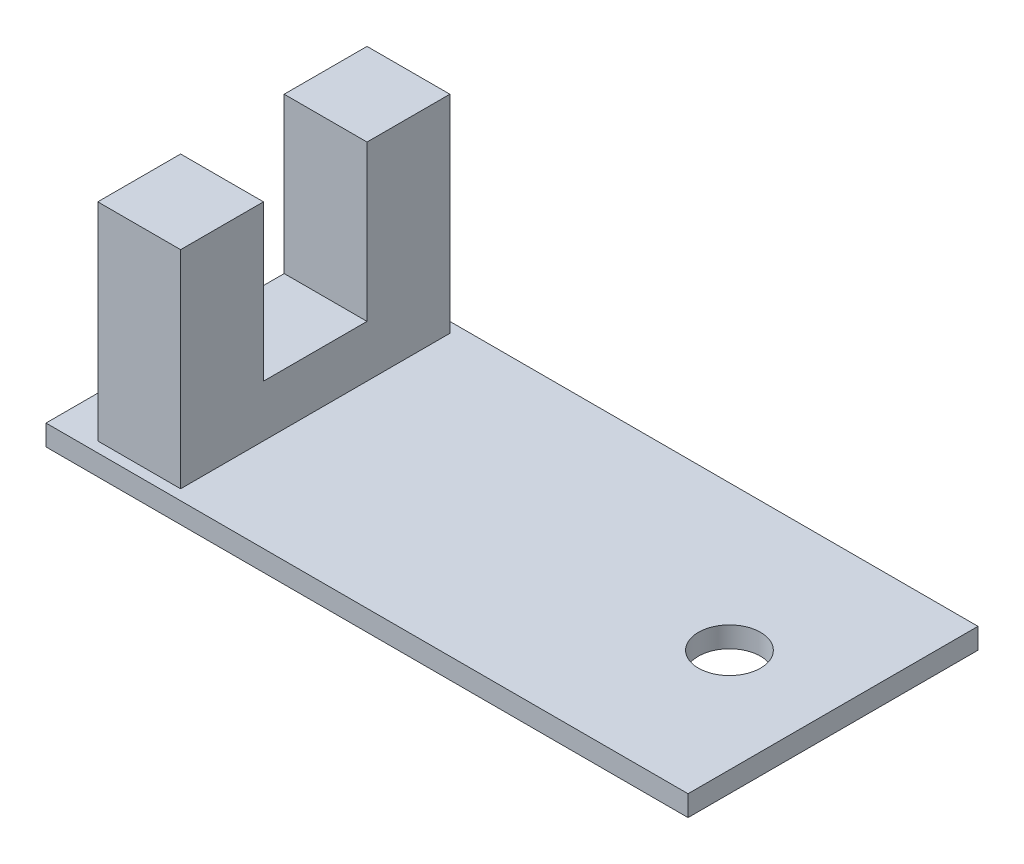
ISO-10303-21;
HEADER;
FILE_DESCRIPTION(('STEP AP214'),'2;1');
FILE_NAME('part.step','',(''),(''),'','','');
FILE_SCHEMA(('AUTOMOTIVE_DESIGN { 1 0 10303 214 1 1 1 1 }'));
ENDSEC;
DATA;
#1=APPLICATION_CONTEXT('core data for automotive mechanical design processes');
#2=APPLICATION_PROTOCOL_DEFINITION('international standard','automotive_design',2000,#1);
#3=PRODUCT_CONTEXT('',#1,'mechanical');
#4=PRODUCT('Part','Part','',(#3));
#5=PRODUCT_RELATED_PRODUCT_CATEGORY('part','',(#4));
#6=PRODUCT_DEFINITION_FORMATION('','',#4);
#7=PRODUCT_DEFINITION_CONTEXT('part definition',#1,'design');
#8=PRODUCT_DEFINITION('design','',#6,#7);
#9=PRODUCT_DEFINITION_SHAPE('','',#8);
#10=(LENGTH_UNIT() NAMED_UNIT(*) SI_UNIT(.MILLI.,.METRE.));
#11=(NAMED_UNIT(*) PLANE_ANGLE_UNIT() SI_UNIT($,.RADIAN.));
#12=(NAMED_UNIT(*) SI_UNIT($,.STERADIAN.) SOLID_ANGLE_UNIT());
#13=UNCERTAINTY_MEASURE_WITH_UNIT(LENGTH_MEASURE(1.E-05),#10,'distance_accuracy_value','');
#14=(GEOMETRIC_REPRESENTATION_CONTEXT(3) GLOBAL_UNCERTAINTY_ASSIGNED_CONTEXT((#13)) GLOBAL_UNIT_ASSIGNED_CONTEXT((#10,
#11,#12)) REPRESENTATION_CONTEXT('',''));
#15=CARTESIAN_POINT('',(0.,0.,0.));
#16=DIRECTION('',(0.,0.,1.));
#17=DIRECTION('',(1.,0.,0.));
#18=AXIS2_PLACEMENT_3D('',#15,#16,#17);
#19=CARTESIAN_POINT('',(0.,1.,0.));
#20=DIRECTION('',(0.,1.,0.));
#21=DIRECTION('',(0.,0.,1.));
#22=AXIS2_PLACEMENT_3D('',#19,#20,#21);
#23=PLANE('',#22);
#24=CARTESIAN_POINT('',(26.,1.,7.));
#25=DIRECTION('',(0.,1.,0.));
#26=DIRECTION('',(0.,0.,1.));
#27=AXIS2_PLACEMENT_3D('',#24,#25,#26);
#28=CIRCLE('',#27,1.5);
#29=CARTESIAN_POINT('',(26.,1.,8.5));
#30=VERTEX_POINT('',#29);
#31=EDGE_CURVE('E361',#30,#30,#28,.T.);
#32=ORIENTED_EDGE('',*,*,#31,.F.);
#33=EDGE_LOOP('',(#32));
#34=FACE_BOUND('',#33,.T.);
#35=DIRECTION('',(0.,0.,1.));
#36=VECTOR('',#35,1.);
#37=CARTESIAN_POINT('',(0.,1.,0.));
#38=LINE('',#37,#36);
#39=CARTESIAN_POINT('',(0.,1.,0.));
#40=VERTEX_POINT('',#39);
#41=CARTESIAN_POINT('',(0.,1.,14.));
#42=VERTEX_POINT('',#41);
#43=EDGE_CURVE('E172',#40,#42,#38,.T.);
#44=ORIENTED_EDGE('',*,*,#43,.T.);
#45=DIRECTION('',(1.,0.,0.));
#46=VECTOR('',#45,1.);
#47=CARTESIAN_POINT('',(0.,1.,14.));
#48=LINE('',#47,#46);
#49=CARTESIAN_POINT('',(31.,1.,14.));
#50=VERTEX_POINT('',#49);
#51=EDGE_CURVE('E84',#42,#50,#48,.T.);
#52=ORIENTED_EDGE('',*,*,#51,.T.);
#53=DIRECTION('',(0.,0.,-1.));
#54=VECTOR('',#53,1.);
#55=CARTESIAN_POINT('',(31.,1.,0.));
#56=LINE('',#55,#54);
#57=CARTESIAN_POINT('',(31.,1.,0.));
#58=VERTEX_POINT('',#57);
#59=EDGE_CURVE('E175',#50,#58,#56,.T.);
#60=ORIENTED_EDGE('',*,*,#59,.T.);
#61=DIRECTION('',(-1.,0.,0.));
#62=VECTOR('',#61,1.);
#63=CARTESIAN_POINT('',(0.,1.,0.));
#64=LINE('',#63,#62);
#65=EDGE_CURVE('E56',#58,#40,#64,.T.);
#66=ORIENTED_EDGE('',*,*,#65,.T.);
#67=EDGE_LOOP('',(#44,#52,#60,#66));
#68=FACE_BOUND('',#67,.T.);
#69=DIRECTION('',(0.,0.,1.));
#70=VECTOR('',#69,1.);
#71=CARTESIAN_POINT('',(2.,1.,13.5));
#72=LINE('',#71,#70);
#73=CARTESIAN_POINT('',(2.,1.,0.5));
#74=VERTEX_POINT('',#73);
#75=CARTESIAN_POINT('',(2.,1.,13.5));
#76=VERTEX_POINT('',#75);
#77=EDGE_CURVE('E388',#74,#76,#72,.T.);
#78=ORIENTED_EDGE('',*,*,#77,.F.);
#79=DIRECTION('',(-1.,0.,0.));
#80=VECTOR('',#79,1.);
#81=CARTESIAN_POINT('',(2.,1.,0.5));
#82=LINE('',#81,#80);
#83=CARTESIAN_POINT('',(6.,1.,0.5));
#84=VERTEX_POINT('',#83);
#85=EDGE_CURVE('E363',#84,#74,#82,.T.);
#86=ORIENTED_EDGE('',*,*,#85,.F.);
#87=DIRECTION('',(0.,0.,-1.));
#88=VECTOR('',#87,1.);
#89=CARTESIAN_POINT('',(6.,1.,13.5));
#90=LINE('',#89,#88);
#91=CARTESIAN_POINT('',(6.,1.,13.5));
#92=VERTEX_POINT('',#91);
#93=EDGE_CURVE('E47',#92,#84,#90,.T.);
#94=ORIENTED_EDGE('',*,*,#93,.F.);
#95=DIRECTION('',(1.,0.,0.));
#96=VECTOR('',#95,1.);
#97=CARTESIAN_POINT('',(2.,1.,13.5));
#98=LINE('',#97,#96);
#99=EDGE_CURVE('E393',#76,#92,#98,.T.);
#100=ORIENTED_EDGE('',*,*,#99,.F.);
#101=EDGE_LOOP('',(#78,#86,#94,#100));
#102=FACE_BOUND('',#101,.T.);
#103=ADVANCED_FACE('F32',(#34,#68,#102),#23,.T.);
#104=CARTESIAN_POINT('',(0.,1.,0.));
#105=DIRECTION('',(1.,0.,0.));
#106=DIRECTION('',(0.,0.,-1.));
#107=AXIS2_PLACEMENT_3D('',#104,#105,#106);
#108=PLANE('',#107);
#109=DIRECTION('',(0.,0.,1.));
#110=VECTOR('',#109,1.);
#111=CARTESIAN_POINT('',(0.,0.,0.));
#112=LINE('',#111,#110);
#113=CARTESIAN_POINT('',(0.,0.,0.));
#114=VERTEX_POINT('',#113);
#115=CARTESIAN_POINT('',(0.,0.,14.));
#116=VERTEX_POINT('',#115);
#117=EDGE_CURVE('E171',#114,#116,#112,.T.);
#118=ORIENTED_EDGE('',*,*,#117,.T.);
#119=DIRECTION('',(0.,-1.,0.));
#120=VECTOR('',#119,1.);
#121=CARTESIAN_POINT('',(0.,1.,14.));
#122=LINE('',#121,#120);
#123=EDGE_CURVE('E11',#42,#116,#122,.T.);
#124=ORIENTED_EDGE('',*,*,#123,.F.);
#125=ORIENTED_EDGE('',*,*,#43,.F.);
#126=DIRECTION('',(0.,-1.,0.));
#127=VECTOR('',#126,1.);
#128=CARTESIAN_POINT('',(0.,1.,0.));
#129=LINE('',#128,#127);
#130=EDGE_CURVE('E178',#40,#114,#129,.T.);
#131=ORIENTED_EDGE('',*,*,#130,.T.);
#132=EDGE_LOOP('',(#118,#124,#125,#131));
#133=FACE_BOUND('',#132,.T.);
#134=ADVANCED_FACE('F34',(#133),#108,.F.);
#135=CARTESIAN_POINT('',(0.,1.,14.));
#136=DIRECTION('',(0.,0.,-1.));
#137=DIRECTION('',(-1.,0.,0.));
#138=AXIS2_PLACEMENT_3D('',#135,#136,#137);
#139=PLANE('',#138);
#140=DIRECTION('',(1.,0.,0.));
#141=VECTOR('',#140,1.);
#142=CARTESIAN_POINT('',(0.,0.,14.));
#143=LINE('',#142,#141);
#144=CARTESIAN_POINT('',(31.,0.,14.));
#145=VERTEX_POINT('',#144);
#146=EDGE_CURVE('E181',#116,#145,#143,.T.);
#147=ORIENTED_EDGE('',*,*,#146,.T.);
#148=DIRECTION('',(0.,-1.,0.));
#149=VECTOR('',#148,1.);
#150=CARTESIAN_POINT('',(31.,1.,14.));
#151=LINE('',#150,#149);
#152=EDGE_CURVE('E40',#50,#145,#151,.T.);
#153=ORIENTED_EDGE('',*,*,#152,.F.);
#154=ORIENTED_EDGE('',*,*,#51,.F.);
#155=ORIENTED_EDGE('',*,*,#123,.T.);
#156=EDGE_LOOP('',(#147,#153,#154,#155));
#157=FACE_BOUND('',#156,.T.);
#158=ADVANCED_FACE('F209',(#157),#139,.F.);
#159=CARTESIAN_POINT('',(31.,1.,0.));
#160=DIRECTION('',(-1.,0.,0.));
#161=DIRECTION('',(0.,0.,1.));
#162=AXIS2_PLACEMENT_3D('',#159,#160,#161);
#163=PLANE('',#162);
#164=DIRECTION('',(0.,0.,-1.));
#165=VECTOR('',#164,1.);
#166=CARTESIAN_POINT('',(31.,0.,0.));
#167=LINE('',#166,#165);
#168=CARTESIAN_POINT('',(31.,0.,0.));
#169=VERTEX_POINT('',#168);
#170=EDGE_CURVE('E183',#145,#169,#167,.T.);
#171=ORIENTED_EDGE('',*,*,#170,.T.);
#172=DIRECTION('',(0.,-1.,0.));
#173=VECTOR('',#172,1.);
#174=CARTESIAN_POINT('',(31.,1.,0.));
#175=LINE('',#174,#173);
#176=EDGE_CURVE('E187',#58,#169,#175,.T.);
#177=ORIENTED_EDGE('',*,*,#176,.F.);
#178=ORIENTED_EDGE('',*,*,#59,.F.);
#179=ORIENTED_EDGE('',*,*,#152,.T.);
#180=EDGE_LOOP('',(#171,#177,#178,#179));
#181=FACE_BOUND('',#180,.T.);
#182=ADVANCED_FACE('F192',(#181),#163,.F.);
#183=CARTESIAN_POINT('',(0.,1.,0.));
#184=DIRECTION('',(0.,0.,1.));
#185=DIRECTION('',(1.,0.,0.));
#186=AXIS2_PLACEMENT_3D('',#183,#184,#185);
#187=PLANE('',#186);
#188=DIRECTION('',(-1.,0.,0.));
#189=VECTOR('',#188,1.);
#190=CARTESIAN_POINT('',(0.,0.,0.));
#191=LINE('',#190,#189);
#192=EDGE_CURVE('E77',#169,#114,#191,.T.);
#193=ORIENTED_EDGE('',*,*,#192,.T.);
#194=ORIENTED_EDGE('',*,*,#130,.F.);
#195=ORIENTED_EDGE('',*,*,#65,.F.);
#196=ORIENTED_EDGE('',*,*,#176,.T.);
#197=EDGE_LOOP('',(#193,#194,#195,#196));
#198=FACE_BOUND('',#197,.T.);
#199=ADVANCED_FACE('F200',(#198),#187,.F.);
#200=CARTESIAN_POINT('',(0.,0.,0.));
#201=DIRECTION('',(0.,1.,0.));
#202=DIRECTION('',(0.,0.,1.));
#203=AXIS2_PLACEMENT_3D('',#200,#201,#202);
#204=PLANE('',#203);
#205=CARTESIAN_POINT('',(26.,0.,7.));
#206=DIRECTION('',(0.,1.,0.));
#207=DIRECTION('',(0.,0.,1.));
#208=AXIS2_PLACEMENT_3D('',#205,#206,#207);
#209=CIRCLE('',#208,1.5);
#210=CARTESIAN_POINT('',(26.,0.,8.5));
#211=VERTEX_POINT('',#210);
#212=EDGE_CURVE('E359',#211,#211,#209,.T.);
#213=ORIENTED_EDGE('',*,*,#212,.T.);
#214=EDGE_LOOP('',(#213));
#215=FACE_BOUND('',#214,.T.);
#216=ORIENTED_EDGE('',*,*,#117,.F.);
#217=ORIENTED_EDGE('',*,*,#192,.F.);
#218=ORIENTED_EDGE('',*,*,#170,.F.);
#219=ORIENTED_EDGE('',*,*,#146,.F.);
#220=EDGE_LOOP('',(#216,#217,#218,#219));
#221=FACE_BOUND('',#220,.T.);
#222=ADVANCED_FACE('F196',(#215,#221),#204,.F.);
#223=CARTESIAN_POINT('',(2.,11.,13.5));
#224=DIRECTION('',(1.,0.,0.));
#225=DIRECTION('',(0.,0.,-1.));
#226=AXIS2_PLACEMENT_3D('',#223,#224,#225);
#227=PLANE('',#226);
#228=ORIENTED_EDGE('',*,*,#77,.T.);
#229=DIRECTION('',(0.,-1.,0.));
#230=VECTOR('',#229,1.);
#231=CARTESIAN_POINT('',(2.,11.,13.5));
#232=LINE('',#231,#230);
#233=CARTESIAN_POINT('',(2.,11.,13.5));
#234=VERTEX_POINT('',#233);
#235=EDGE_CURVE('E169',#234,#76,#232,.T.);
#236=ORIENTED_EDGE('',*,*,#235,.F.);
#237=DIRECTION('',(0.,0.,1.));
#238=VECTOR('',#237,1.);
#239=CARTESIAN_POINT('',(2.,11.,13.5));
#240=LINE('',#239,#238);
#241=CARTESIAN_POINT('',(2.,11.,9.5));
#242=VERTEX_POINT('',#241);
#243=EDGE_CURVE('E158',#242,#234,#240,.T.);
#244=ORIENTED_EDGE('',*,*,#243,.F.);
#245=DIRECTION('',(0.,-1.,0.));
#246=VECTOR('',#245,1.);
#247=CARTESIAN_POINT('',(2.,11.,9.5));
#248=LINE('',#247,#246);
#249=CARTESIAN_POINT('',(2.,3.5,9.5));
#250=VERTEX_POINT('',#249);
#251=EDGE_CURVE('E148',#242,#250,#248,.T.);
#252=ORIENTED_EDGE('',*,*,#251,.T.);
#253=DIRECTION('',(0.,0.,1.));
#254=VECTOR('',#253,1.);
#255=CARTESIAN_POINT('',(2.,3.5,4.5));
#256=LINE('',#255,#254);
#257=CARTESIAN_POINT('',(2.,3.5,4.5));
#258=VERTEX_POINT('',#257);
#259=EDGE_CURVE('E131',#258,#250,#256,.T.);
#260=ORIENTED_EDGE('',*,*,#259,.F.);
#261=DIRECTION('',(0.,-1.,0.));
#262=VECTOR('',#261,1.);
#263=CARTESIAN_POINT('',(2.,11.,4.5));
#264=LINE('',#263,#262);
#265=CARTESIAN_POINT('',(2.,11.,4.5));
#266=VERTEX_POINT('',#265);
#267=EDGE_CURVE('E386',#266,#258,#264,.T.);
#268=ORIENTED_EDGE('',*,*,#267,.F.);
#269=DIRECTION('',(0.,0.,1.));
#270=VECTOR('',#269,1.);
#271=CARTESIAN_POINT('',(2.,11.,4.5));
#272=LINE('',#271,#270);
#273=CARTESIAN_POINT('',(2.,11.,0.5));
#274=VERTEX_POINT('',#273);
#275=EDGE_CURVE('E367',#274,#266,#272,.T.);
#276=ORIENTED_EDGE('',*,*,#275,.F.);
#277=DIRECTION('',(0.,-1.,0.));
#278=VECTOR('',#277,1.);
#279=CARTESIAN_POINT('',(2.,11.,0.5));
#280=LINE('',#279,#278);
#281=EDGE_CURVE('E376',#274,#74,#280,.T.);
#282=ORIENTED_EDGE('',*,*,#281,.T.);
#283=EDGE_LOOP('',(#228,#236,#244,#252,#260,#268,#276,#282));
#284=FACE_BOUND('',#283,.T.);
#285=ADVANCED_FACE('F155',(#284),#227,.F.);
#286=CARTESIAN_POINT('',(2.,11.,13.5));
#287=DIRECTION('',(0.,0.,-1.));
#288=DIRECTION('',(-1.,0.,0.));
#289=AXIS2_PLACEMENT_3D('',#286,#287,#288);
#290=PLANE('',#289);
#291=ORIENTED_EDGE('',*,*,#99,.T.);
#292=DIRECTION('',(0.,-1.,0.));
#293=VECTOR('',#292,1.);
#294=CARTESIAN_POINT('',(6.,11.,13.5));
#295=LINE('',#294,#293);
#296=CARTESIAN_POINT('',(6.,11.,13.5));
#297=VERTEX_POINT('',#296);
#298=EDGE_CURVE('E161',#297,#92,#295,.T.);
#299=ORIENTED_EDGE('',*,*,#298,.F.);
#300=DIRECTION('',(1.,0.,0.));
#301=VECTOR('',#300,1.);
#302=CARTESIAN_POINT('',(2.,11.,13.5));
#303=LINE('',#302,#301);
#304=EDGE_CURVE('E390',#234,#297,#303,.T.);
#305=ORIENTED_EDGE('',*,*,#304,.F.);
#306=ORIENTED_EDGE('',*,*,#235,.T.);
#307=EDGE_LOOP('',(#291,#299,#305,#306));
#308=FACE_BOUND('',#307,.T.);
#309=ADVANCED_FACE('F221',(#308),#290,.F.);
#310=CARTESIAN_POINT('',(6.,11.,13.5));
#311=DIRECTION('',(-1.,0.,0.));
#312=DIRECTION('',(0.,0.,1.));
#313=AXIS2_PLACEMENT_3D('',#310,#311,#312);
#314=PLANE('',#313);
#315=ORIENTED_EDGE('',*,*,#93,.T.);
#316=DIRECTION('',(0.,-1.,0.));
#317=VECTOR('',#316,1.);
#318=CARTESIAN_POINT('',(6.,11.,0.5));
#319=LINE('',#318,#317);
#320=CARTESIAN_POINT('',(6.,11.,0.5));
#321=VERTEX_POINT('',#320);
#322=EDGE_CURVE('E381',#321,#84,#319,.T.);
#323=ORIENTED_EDGE('',*,*,#322,.F.);
#324=DIRECTION('',(0.,0.,-1.));
#325=VECTOR('',#324,1.);
#326=CARTESIAN_POINT('',(6.,11.,4.5));
#327=LINE('',#326,#325);
#328=CARTESIAN_POINT('',(6.,11.,4.5));
#329=VERTEX_POINT('',#328);
#330=EDGE_CURVE('E372',#329,#321,#327,.T.);
#331=ORIENTED_EDGE('',*,*,#330,.F.);
#332=DIRECTION('',(0.,-1.,0.));
#333=VECTOR('',#332,1.);
#334=CARTESIAN_POINT('',(6.,11.,4.5));
#335=LINE('',#334,#333);
#336=CARTESIAN_POINT('',(6.,3.5,4.5));
#337=VERTEX_POINT('',#336);
#338=EDGE_CURVE('E383',#329,#337,#335,.T.);
#339=ORIENTED_EDGE('',*,*,#338,.T.);
#340=DIRECTION('',(0.,0.,-1.));
#341=VECTOR('',#340,1.);
#342=CARTESIAN_POINT('',(6.,3.5,4.5));
#343=LINE('',#342,#341);
#344=CARTESIAN_POINT('',(6.,3.5,9.5));
#345=VERTEX_POINT('',#344);
#346=EDGE_CURVE('E152',#345,#337,#343,.T.);
#347=ORIENTED_EDGE('',*,*,#346,.F.);
#348=DIRECTION('',(0.,-1.,0.));
#349=VECTOR('',#348,1.);
#350=CARTESIAN_POINT('',(6.,11.,9.5));
#351=LINE('',#350,#349);
#352=CARTESIAN_POINT('',(6.,11.,9.5));
#353=VERTEX_POINT('',#352);
#354=EDGE_CURVE('E151',#353,#345,#351,.T.);
#355=ORIENTED_EDGE('',*,*,#354,.F.);
#356=DIRECTION('',(0.,0.,-1.));
#357=VECTOR('',#356,1.);
#358=CARTESIAN_POINT('',(6.,11.,13.5));
#359=LINE('',#358,#357);
#360=EDGE_CURVE('E163',#297,#353,#359,.T.);
#361=ORIENTED_EDGE('',*,*,#360,.F.);
#362=ORIENTED_EDGE('',*,*,#298,.T.);
#363=EDGE_LOOP('',(#315,#323,#331,#339,#347,#355,#361,#362));
#364=FACE_BOUND('',#363,.T.);
#365=ADVANCED_FACE('F224',(#364),#314,.F.);
#366=CARTESIAN_POINT('',(2.,11.,9.5));
#367=DIRECTION('',(0.,0.,1.));
#368=DIRECTION('',(1.,0.,0.));
#369=AXIS2_PLACEMENT_3D('',#366,#367,#368);
#370=PLANE('',#369);
#371=ORIENTED_EDGE('',*,*,#354,.T.);
#372=DIRECTION('',(1.,0.,0.));
#373=VECTOR('',#372,1.);
#374=CARTESIAN_POINT('',(2.,3.5,9.5));
#375=LINE('',#374,#373);
#376=EDGE_CURVE('E134',#250,#345,#375,.T.);
#377=ORIENTED_EDGE('',*,*,#376,.F.);
#378=ORIENTED_EDGE('',*,*,#251,.F.);
#379=DIRECTION('',(-1.,0.,0.));
#380=VECTOR('',#379,1.);
#381=CARTESIAN_POINT('',(2.,11.,9.5));
#382=LINE('',#381,#380);
#383=EDGE_CURVE('E159',#353,#242,#382,.T.);
#384=ORIENTED_EDGE('',*,*,#383,.F.);
#385=EDGE_LOOP('',(#371,#377,#378,#384));
#386=FACE_BOUND('',#385,.T.);
#387=ADVANCED_FACE('F146',(#386),#370,.F.);
#388=CARTESIAN_POINT('',(0.,11.,0.));
#389=DIRECTION('',(0.,-1.,0.));
#390=DIRECTION('',(0.,0.,-1.));
#391=AXIS2_PLACEMENT_3D('',#388,#389,#390);
#392=PLANE('',#391);
#393=ORIENTED_EDGE('',*,*,#243,.T.);
#394=ORIENTED_EDGE('',*,*,#304,.T.);
#395=ORIENTED_EDGE('',*,*,#360,.T.);
#396=ORIENTED_EDGE('',*,*,#383,.T.);
#397=EDGE_LOOP('',(#393,#394,#395,#396));
#398=FACE_BOUND('',#397,.T.);
#399=ADVANCED_FACE('F230',(#398),#392,.F.);
#400=CARTESIAN_POINT('',(2.,11.,4.5));
#401=DIRECTION('',(0.,0.,-1.));
#402=DIRECTION('',(-1.,0.,0.));
#403=AXIS2_PLACEMENT_3D('',#400,#401,#402);
#404=PLANE('',#403);
#405=ORIENTED_EDGE('',*,*,#267,.T.);
#406=DIRECTION('',(-1.,0.,0.));
#407=VECTOR('',#406,1.);
#408=CARTESIAN_POINT('',(2.,3.5,4.5));
#409=LINE('',#408,#407);
#410=EDGE_CURVE('E137',#337,#258,#409,.T.);
#411=ORIENTED_EDGE('',*,*,#410,.F.);
#412=ORIENTED_EDGE('',*,*,#338,.F.);
#413=DIRECTION('',(1.,0.,0.));
#414=VECTOR('',#413,1.);
#415=CARTESIAN_POINT('',(2.,11.,4.5));
#416=LINE('',#415,#414);
#417=EDGE_CURVE('E370',#266,#329,#416,.T.);
#418=ORIENTED_EDGE('',*,*,#417,.F.);
#419=EDGE_LOOP('',(#405,#411,#412,#418));
#420=FACE_BOUND('',#419,.T.);
#421=ADVANCED_FACE('F233',(#420),#404,.F.);
#422=CARTESIAN_POINT('',(2.,11.,0.5));
#423=DIRECTION('',(0.,0.,1.));
#424=DIRECTION('',(1.,0.,0.));
#425=AXIS2_PLACEMENT_3D('',#422,#423,#424);
#426=PLANE('',#425);
#427=ORIENTED_EDGE('',*,*,#85,.T.);
#428=ORIENTED_EDGE('',*,*,#281,.F.);
#429=DIRECTION('',(-1.,0.,0.));
#430=VECTOR('',#429,1.);
#431=CARTESIAN_POINT('',(2.,11.,0.5));
#432=LINE('',#431,#430);
#433=EDGE_CURVE('E374',#321,#274,#432,.T.);
#434=ORIENTED_EDGE('',*,*,#433,.F.);
#435=ORIENTED_EDGE('',*,*,#322,.T.);
#436=EDGE_LOOP('',(#427,#428,#434,#435));
#437=FACE_BOUND('',#436,.T.);
#438=ADVANCED_FACE('F237',(#437),#426,.F.);
#439=CARTESIAN_POINT('',(0.,11.,0.));
#440=DIRECTION('',(0.,-1.,0.));
#441=DIRECTION('',(0.,0.,-1.));
#442=AXIS2_PLACEMENT_3D('',#439,#440,#441);
#443=PLANE('',#442);
#444=ORIENTED_EDGE('',*,*,#275,.T.);
#445=ORIENTED_EDGE('',*,*,#417,.T.);
#446=ORIENTED_EDGE('',*,*,#330,.T.);
#447=ORIENTED_EDGE('',*,*,#433,.T.);
#448=EDGE_LOOP('',(#444,#445,#446,#447));
#449=FACE_BOUND('',#448,.T.);
#450=ADVANCED_FACE('F241',(#449),#443,.F.);
#451=CARTESIAN_POINT('',(26.,0.,7.));
#452=DIRECTION('',(0.,1.,0.));
#453=DIRECTION('',(0.,0.,1.));
#454=AXIS2_PLACEMENT_3D('',#451,#452,#453);
#455=CYLINDRICAL_SURFACE('',#454,1.5);
#456=ORIENTED_EDGE('',*,*,#212,.F.);
#457=EDGE_LOOP('',(#456));
#458=FACE_BOUND('',#457,.T.);
#459=ORIENTED_EDGE('',*,*,#31,.T.);
#460=EDGE_LOOP('',(#459));
#461=FACE_BOUND('',#460,.T.);
#462=ADVANCED_FACE('F245',(#458,#461),#455,.F.);
#463=CARTESIAN_POINT('',(0.,3.5,0.));
#464=DIRECTION('',(0.,1.,0.));
#465=DIRECTION('',(0.,0.,1.));
#466=AXIS2_PLACEMENT_3D('',#463,#464,#465);
#467=PLANE('',#466);
#468=ORIENTED_EDGE('',*,*,#259,.T.);
#469=ORIENTED_EDGE('',*,*,#376,.T.);
#470=ORIENTED_EDGE('',*,*,#346,.T.);
#471=ORIENTED_EDGE('',*,*,#410,.T.);
#472=EDGE_LOOP('',(#468,#469,#470,#471));
#473=FACE_BOUND('',#472,.T.);
#474=ADVANCED_FACE('F133',(#473),#467,.T.);
#475=CLOSED_SHELL('',(#103,#134,#158,#182,#199,#222,#285,#309,#365,#387,#399,#421,#438,#450,
#462,#474));
#476=MANIFOLD_SOLID_BREP('B2',#475);
#477=ADVANCED_BREP_SHAPE_REPRESENTATION('',(#18,#476),#14);
#478=SHAPE_DEFINITION_REPRESENTATION(#9,#477);
ENDSEC;
END-ISO-10303-21;
